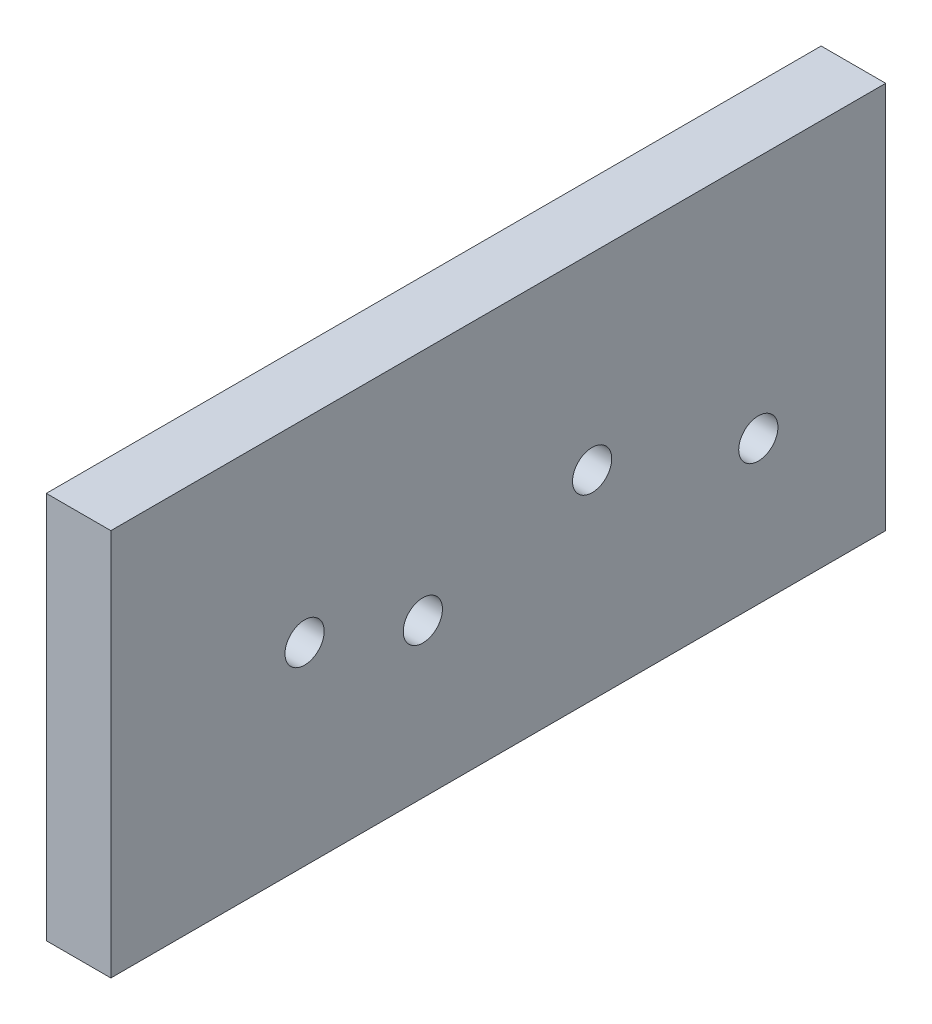
ISO-10303-21;
HEADER;
FILE_DESCRIPTION(('STEP AP214'),'2;1');
FILE_NAME('part.step','',(''),(''),'','','');
FILE_SCHEMA(('AUTOMOTIVE_DESIGN { 1 0 10303 214 1 1 1 1 }'));
ENDSEC;
DATA;
#1=APPLICATION_CONTEXT('core data for automotive mechanical design processes');
#2=APPLICATION_PROTOCOL_DEFINITION('international standard','automotive_design',2000,#1);
#3=PRODUCT_CONTEXT('',#1,'mechanical');
#4=PRODUCT('Part','Part','',(#3));
#5=PRODUCT_RELATED_PRODUCT_CATEGORY('part','',(#4));
#6=PRODUCT_DEFINITION_FORMATION('','',#4);
#7=PRODUCT_DEFINITION_CONTEXT('part definition',#1,'design');
#8=PRODUCT_DEFINITION('design','',#6,#7);
#9=PRODUCT_DEFINITION_SHAPE('','',#8);
#10=(LENGTH_UNIT() NAMED_UNIT(*) SI_UNIT(.MILLI.,.METRE.));
#11=(NAMED_UNIT(*) PLANE_ANGLE_UNIT() SI_UNIT($,.RADIAN.));
#12=(NAMED_UNIT(*) SI_UNIT($,.STERADIAN.) SOLID_ANGLE_UNIT());
#13=UNCERTAINTY_MEASURE_WITH_UNIT(LENGTH_MEASURE(1.E-05),#10,'distance_accuracy_value','');
#14=(GEOMETRIC_REPRESENTATION_CONTEXT(3) GLOBAL_UNCERTAINTY_ASSIGNED_CONTEXT((#13)) GLOBAL_UNIT_ASSIGNED_CONTEXT((#10,
#11,#12)) REPRESENTATION_CONTEXT('',''));
#15=CARTESIAN_POINT('',(0.,0.,0.));
#16=DIRECTION('',(0.,0.,1.));
#17=DIRECTION('',(1.,0.,0.));
#18=AXIS2_PLACEMENT_3D('',#15,#16,#17);
#19=CARTESIAN_POINT('',(12.7,-9.873506971,-51.1434579937716));
#20=DIRECTION('',(-1.,0.,0.));
#21=DIRECTION('',(0.,0.,1.));
#22=AXIS2_PLACEMENT_3D('',#19,#20,#21);
#23=CYLINDRICAL_SURFACE('',#22,3.85455777521835);
#24=CARTESIAN_POINT('',(12.7,-9.873506971,-51.1434579937716));
#25=DIRECTION('',(1.,0.,0.));
#26=DIRECTION('',(0.,0.,-1.));
#27=AXIS2_PLACEMENT_3D('',#24,#25,#26);
#28=CIRCLE('',#27,3.85455777521835);
#29=CARTESIAN_POINT('',(12.7,-9.873506971,-54.99801576899));
#30=VERTEX_POINT('',#29);
#31=EDGE_CURVE('E166',#30,#30,#28,.T.);
#32=ORIENTED_EDGE('',*,*,#31,.T.);
#33=EDGE_LOOP('',(#32));
#34=FACE_BOUND('',#33,.T.);
#35=CARTESIAN_POINT('',(5.08,-9.873506971,-51.1434579937716));
#36=DIRECTION('',(-1.,0.,0.));
#37=DIRECTION('',(0.,0.,1.));
#38=AXIS2_PLACEMENT_3D('',#35,#36,#37);
#39=CIRCLE('',#38,3.85455777521835);
#40=CARTESIAN_POINT('',(5.08,-9.873506971,-47.2889002185533));
#41=VERTEX_POINT('',#40);
#42=EDGE_CURVE('E55',#41,#41,#39,.T.);
#43=ORIENTED_EDGE('',*,*,#42,.T.);
#44=EDGE_LOOP('',(#43));
#45=FACE_BOUND('',#44,.T.);
#46=ADVANCED_FACE('F51',(#34,#45),#23,.F.);
#47=CARTESIAN_POINT('',(12.7,1.096077429,-18.4577335821185));
#48=DIRECTION('',(-1.,0.,0.));
#49=DIRECTION('',(0.,0.,1.));
#50=AXIS2_PLACEMENT_3D('',#47,#48,#49);
#51=CYLINDRICAL_SURFACE('',#50,3.85455777521835);
#52=CARTESIAN_POINT('',(12.7,1.096077429,-18.4577335821185));
#53=DIRECTION('',(1.,0.,0.));
#54=DIRECTION('',(0.,0.,-1.));
#55=AXIS2_PLACEMENT_3D('',#52,#53,#54);
#56=CIRCLE('',#55,3.85455777521835);
#57=CARTESIAN_POINT('',(12.7,1.096077429,-22.3122913573368));
#58=VERTEX_POINT('',#57);
#59=EDGE_CURVE('E162',#58,#58,#56,.T.);
#60=ORIENTED_EDGE('',*,*,#59,.T.);
#61=EDGE_LOOP('',(#60));
#62=FACE_BOUND('',#61,.T.);
#63=CARTESIAN_POINT('',(5.08,1.096077429,-18.4577335821185));
#64=DIRECTION('',(-1.,0.,0.));
#65=DIRECTION('',(0.,0.,1.));
#66=AXIS2_PLACEMENT_3D('',#63,#64,#65);
#67=CIRCLE('',#66,3.85455777521835);
#68=CARTESIAN_POINT('',(5.08,1.096077429,-14.6031758069001));
#69=VERTEX_POINT('',#68);
#70=EDGE_CURVE('E201',#69,#69,#67,.T.);
#71=ORIENTED_EDGE('',*,*,#70,.T.);
#72=EDGE_LOOP('',(#71));
#73=FACE_BOUND('',#72,.T.);
#74=ADVANCED_FACE('F287',(#62,#73),#51,.F.);
#75=CARTESIAN_POINT('',(12.7,0.,38.1));
#76=DIRECTION('',(-1.,0.,0.));
#77=DIRECTION('',(0.,0.,1.));
#78=AXIS2_PLACEMENT_3D('',#75,#76,#77);
#79=CYLINDRICAL_SURFACE('',#78,3.85455777521835);
#80=CARTESIAN_POINT('',(12.7,0.,38.1));
#81=DIRECTION('',(1.,0.,0.));
#82=DIRECTION('',(0.,0.,-1.));
#83=AXIS2_PLACEMENT_3D('',#80,#81,#82);
#84=CIRCLE('',#83,3.85455777521835);
#85=CARTESIAN_POINT('',(12.7,0.,34.2454422247817));
#86=VERTEX_POINT('',#85);
#87=EDGE_CURVE('E158',#86,#86,#84,.T.);
#88=ORIENTED_EDGE('',*,*,#87,.T.);
#89=EDGE_LOOP('',(#88));
#90=FACE_BOUND('',#89,.T.);
#91=CARTESIAN_POINT('',(5.08,0.,38.1));
#92=DIRECTION('',(-1.,0.,0.));
#93=DIRECTION('',(0.,0.,1.));
#94=AXIS2_PLACEMENT_3D('',#91,#92,#93);
#95=CIRCLE('',#94,3.85455777521835);
#96=CARTESIAN_POINT('',(5.08,0.,41.9545577752184));
#97=VERTEX_POINT('',#96);
#98=EDGE_CURVE('E197',#97,#97,#95,.T.);
#99=ORIENTED_EDGE('',*,*,#98,.T.);
#100=EDGE_LOOP('',(#99));
#101=FACE_BOUND('',#100,.T.);
#102=ADVANCED_FACE('F294',(#90,#101),#79,.F.);
#103=CARTESIAN_POINT('',(12.7,-7.860160654,14.8360220129459));
#104=DIRECTION('',(-1.,0.,0.));
#105=DIRECTION('',(0.,0.,1.));
#106=AXIS2_PLACEMENT_3D('',#103,#104,#105);
#107=CYLINDRICAL_SURFACE('',#106,3.85455777521835);
#108=CARTESIAN_POINT('',(12.7,-7.860160654,14.8360220129459));
#109=DIRECTION('',(1.,0.,0.));
#110=DIRECTION('',(0.,0.,-1.));
#111=AXIS2_PLACEMENT_3D('',#108,#109,#110);
#112=CIRCLE('',#111,3.85455777521835);
#113=CARTESIAN_POINT('',(12.7,-7.860160654,10.9814642377276));
#114=VERTEX_POINT('',#113);
#115=EDGE_CURVE('E170',#114,#114,#112,.T.);
#116=ORIENTED_EDGE('',*,*,#115,.T.);
#117=EDGE_LOOP('',(#116));
#118=FACE_BOUND('',#117,.T.);
#119=CARTESIAN_POINT('',(5.08,-7.860160654,14.8360220129459));
#120=DIRECTION('',(-1.,0.,0.));
#121=DIRECTION('',(0.,0.,1.));
#122=AXIS2_PLACEMENT_3D('',#119,#120,#121);
#123=CIRCLE('',#122,3.85455777521835);
#124=CARTESIAN_POINT('',(5.08,-7.860160654,18.6905797881643));
#125=VERTEX_POINT('',#124);
#126=EDGE_CURVE('E193',#125,#125,#123,.T.);
#127=ORIENTED_EDGE('',*,*,#126,.T.);
#128=EDGE_LOOP('',(#127));
#129=FACE_BOUND('',#128,.T.);
#130=ADVANCED_FACE('F298',(#118,#129),#107,.F.);
#131=CARTESIAN_POINT('',(12.7,-38.1,0.));
#132=DIRECTION('',(0.,1.,0.));
#133=DIRECTION('',(0.,0.,1.));
#134=AXIS2_PLACEMENT_3D('',#131,#132,#133);
#135=PLANE('',#134);
#136=CARTESIAN_POINT('',(6.35000000000002,-38.1,-63.5));
#137=DIRECTION('',(0.,-1.,0.));
#138=DIRECTION('',(0.,0.,-1.));
#139=AXIS2_PLACEMENT_3D('',#136,#137,#138);
#140=CIRCLE('',#139,3.17499999999999);
#141=CARTESIAN_POINT('',(6.35000000000002,-38.1,-66.675));
#142=VERTEX_POINT('',#141);
#143=EDGE_CURVE('E122',#142,#142,#140,.T.);
#144=ORIENTED_EDGE('',*,*,#143,.F.);
#145=EDGE_LOOP('',(#144));
#146=FACE_BOUND('',#145,.T.);
#147=CARTESIAN_POINT('',(6.35000000000001,-38.1,0.));
#148=DIRECTION('',(0.,-1.,0.));
#149=DIRECTION('',(0.,0.,-1.));
#150=AXIS2_PLACEMENT_3D('',#147,#148,#149);
#151=CIRCLE('',#150,3.17499999999999);
#152=CARTESIAN_POINT('',(6.35000000000001,-38.1,-3.17499999999997));
#153=VERTEX_POINT('',#152);
#154=EDGE_CURVE('E121',#153,#153,#151,.T.);
#155=ORIENTED_EDGE('',*,*,#154,.F.);
#156=EDGE_LOOP('',(#155));
#157=FACE_BOUND('',#156,.T.);
#158=CARTESIAN_POINT('',(6.35,-38.1,57.15));
#159=DIRECTION('',(0.,-1.,0.));
#160=DIRECTION('',(0.,0.,-1.));
#161=AXIS2_PLACEMENT_3D('',#158,#159,#160);
#162=CIRCLE('',#161,3.17499999999999);
#163=CARTESIAN_POINT('',(6.35,-38.1,53.975));
#164=VERTEX_POINT('',#163);
#165=EDGE_CURVE('E136',#164,#164,#162,.T.);
#166=ORIENTED_EDGE('',*,*,#165,.F.);
#167=EDGE_LOOP('',(#166));
#168=FACE_BOUND('',#167,.T.);
#169=DIRECTION('',(0.,0.,-1.));
#170=VECTOR('',#169,1.);
#171=CARTESIAN_POINT('',(0.,-38.1,0.));
#172=LINE('',#171,#170);
#173=CARTESIAN_POINT('',(0.,-38.1,76.2));
#174=VERTEX_POINT('',#173);
#175=CARTESIAN_POINT('',(0.,-38.1,-76.2));
#176=VERTEX_POINT('',#175);
#177=EDGE_CURVE('E144',#174,#176,#172,.T.);
#178=ORIENTED_EDGE('',*,*,#177,.T.);
#179=DIRECTION('',(-1.,0.,0.));
#180=VECTOR('',#179,1.);
#181=CARTESIAN_POINT('',(12.7,-38.1,-76.2));
#182=LINE('',#181,#180);
#183=CARTESIAN_POINT('',(12.7,-38.1,-76.2));
#184=VERTEX_POINT('',#183);
#185=EDGE_CURVE('E11',#184,#176,#182,.T.);
#186=ORIENTED_EDGE('',*,*,#185,.F.);
#187=DIRECTION('',(0.,0.,-1.));
#188=VECTOR('',#187,1.);
#189=CARTESIAN_POINT('',(12.7,-38.1,0.));
#190=LINE('',#189,#188);
#191=CARTESIAN_POINT('',(12.7,-38.1,76.2));
#192=VERTEX_POINT('',#191);
#193=EDGE_CURVE('E145',#192,#184,#190,.T.);
#194=ORIENTED_EDGE('',*,*,#193,.F.);
#195=DIRECTION('',(-1.,0.,0.));
#196=VECTOR('',#195,1.);
#197=CARTESIAN_POINT('',(12.7,-38.1,76.2));
#198=LINE('',#197,#196);
#199=EDGE_CURVE('E71',#192,#174,#198,.T.);
#200=ORIENTED_EDGE('',*,*,#199,.T.);
#201=EDGE_LOOP('',(#178,#186,#194,#200));
#202=FACE_BOUND('',#201,.T.);
#203=ADVANCED_FACE('F53',(#146,#157,#168,#202),#135,.F.);
#204=CARTESIAN_POINT('',(12.7,0.,-76.2));
#205=DIRECTION('',(0.,0.,1.));
#206=DIRECTION('',(1.,0.,0.));
#207=AXIS2_PLACEMENT_3D('',#204,#205,#206);
#208=PLANE('',#207);
#209=DIRECTION('',(0.,1.,0.));
#210=VECTOR('',#209,1.);
#211=CARTESIAN_POINT('',(0.,0.,-76.2));
#212=LINE('',#211,#210);
#213=CARTESIAN_POINT('',(0.,38.1,-76.2));
#214=VERTEX_POINT('',#213);
#215=EDGE_CURVE('E176',#176,#214,#212,.T.);
#216=ORIENTED_EDGE('',*,*,#215,.T.);
#217=DIRECTION('',(-1.,0.,0.));
#218=VECTOR('',#217,1.);
#219=CARTESIAN_POINT('',(12.7,38.1,-76.2));
#220=LINE('',#219,#218);
#221=CARTESIAN_POINT('',(12.7,38.1,-76.2));
#222=VERTEX_POINT('',#221);
#223=EDGE_CURVE('E62',#222,#214,#220,.T.);
#224=ORIENTED_EDGE('',*,*,#223,.F.);
#225=DIRECTION('',(0.,1.,0.));
#226=VECTOR('',#225,1.);
#227=CARTESIAN_POINT('',(12.7,0.,-76.2));
#228=LINE('',#227,#226);
#229=EDGE_CURVE('E99',#184,#222,#228,.T.);
#230=ORIENTED_EDGE('',*,*,#229,.F.);
#231=ORIENTED_EDGE('',*,*,#185,.T.);
#232=EDGE_LOOP('',(#216,#224,#230,#231));
#233=FACE_BOUND('',#232,.T.);
#234=ADVANCED_FACE('F282',(#233),#208,.F.);
#235=CARTESIAN_POINT('',(12.7,38.1,0.));
#236=DIRECTION('',(0.,1.,0.));
#237=DIRECTION('',(0.,0.,1.));
#238=AXIS2_PLACEMENT_3D('',#235,#236,#237);
#239=PLANE('',#238);
#240=DIRECTION('',(0.,0.,-1.));
#241=VECTOR('',#240,1.);
#242=CARTESIAN_POINT('',(0.,38.1,0.));
#243=LINE('',#242,#241);
#244=CARTESIAN_POINT('',(0.,38.1,76.2));
#245=VERTEX_POINT('',#244);
#246=EDGE_CURVE('E180',#245,#214,#243,.T.);
#247=ORIENTED_EDGE('',*,*,#246,.F.);
#248=DIRECTION('',(-1.,0.,0.));
#249=VECTOR('',#248,1.);
#250=CARTESIAN_POINT('',(12.7,38.1,76.2));
#251=LINE('',#250,#249);
#252=CARTESIAN_POINT('',(12.7,38.1,76.2));
#253=VERTEX_POINT('',#252);
#254=EDGE_CURVE('E87',#253,#245,#251,.T.);
#255=ORIENTED_EDGE('',*,*,#254,.F.);
#256=DIRECTION('',(0.,0.,-1.));
#257=VECTOR('',#256,1.);
#258=CARTESIAN_POINT('',(12.7,38.1,0.));
#259=LINE('',#258,#257);
#260=EDGE_CURVE('E151',#253,#222,#259,.T.);
#261=ORIENTED_EDGE('',*,*,#260,.T.);
#262=ORIENTED_EDGE('',*,*,#223,.T.);
#263=EDGE_LOOP('',(#247,#255,#261,#262));
#264=FACE_BOUND('',#263,.T.);
#265=ADVANCED_FACE('F275',(#264),#239,.T.);
#266=CARTESIAN_POINT('',(12.7,0.,76.2));
#267=DIRECTION('',(0.,0.,1.));
#268=DIRECTION('',(1.,0.,0.));
#269=AXIS2_PLACEMENT_3D('',#266,#267,#268);
#270=PLANE('',#269);
#271=DIRECTION('',(0.,1.,0.));
#272=VECTOR('',#271,1.);
#273=CARTESIAN_POINT('',(0.,0.,76.2));
#274=LINE('',#273,#272);
#275=EDGE_CURVE('E148',#174,#245,#274,.T.);
#276=ORIENTED_EDGE('',*,*,#275,.F.);
#277=ORIENTED_EDGE('',*,*,#199,.F.);
#278=DIRECTION('',(0.,1.,0.));
#279=VECTOR('',#278,1.);
#280=CARTESIAN_POINT('',(12.7,0.,76.2));
#281=LINE('',#280,#279);
#282=EDGE_CURVE('E155',#192,#253,#281,.T.);
#283=ORIENTED_EDGE('',*,*,#282,.T.);
#284=ORIENTED_EDGE('',*,*,#254,.T.);
#285=EDGE_LOOP('',(#276,#277,#283,#284));
#286=FACE_BOUND('',#285,.T.);
#287=ADVANCED_FACE('F273',(#286),#270,.T.);
#288=CARTESIAN_POINT('',(12.7,0.,0.));
#289=DIRECTION('',(1.,0.,0.));
#290=DIRECTION('',(0.,0.,-1.));
#291=AXIS2_PLACEMENT_3D('',#288,#289,#290);
#292=PLANE('',#291);
#293=ORIENTED_EDGE('',*,*,#193,.T.);
#294=ORIENTED_EDGE('',*,*,#229,.T.);
#295=ORIENTED_EDGE('',*,*,#260,.F.);
#296=ORIENTED_EDGE('',*,*,#282,.F.);
#297=EDGE_LOOP('',(#293,#294,#295,#296));
#298=FACE_BOUND('',#297,.T.);
#299=ORIENTED_EDGE('',*,*,#87,.F.);
#300=EDGE_LOOP('',(#299));
#301=FACE_BOUND('',#300,.T.);
#302=ORIENTED_EDGE('',*,*,#59,.F.);
#303=EDGE_LOOP('',(#302));
#304=FACE_BOUND('',#303,.T.);
#305=ORIENTED_EDGE('',*,*,#31,.F.);
#306=EDGE_LOOP('',(#305));
#307=FACE_BOUND('',#306,.T.);
#308=ORIENTED_EDGE('',*,*,#115,.F.);
#309=EDGE_LOOP('',(#308));
#310=FACE_BOUND('',#309,.T.);
#311=ADVANCED_FACE('F264',(#298,#301,#304,#307,#310),#292,.T.);
#312=CARTESIAN_POINT('',(0.,0.,0.));
#313=DIRECTION('',(1.,0.,0.));
#314=DIRECTION('',(0.,0.,-1.));
#315=AXIS2_PLACEMENT_3D('',#312,#313,#314);
#316=PLANE('',#315);
#317=CARTESIAN_POINT('',(0.,0.,38.1));
#318=DIRECTION('',(-1.,0.,0.));
#319=DIRECTION('',(0.,0.,1.));
#320=AXIS2_PLACEMENT_3D('',#317,#318,#319);
#321=CIRCLE('',#320,7.9375);
#322=CARTESIAN_POINT('',(0.,0.,46.0375));
#323=VERTEX_POINT('',#322);
#324=EDGE_CURVE('E243',#323,#323,#321,.T.);
#325=ORIENTED_EDGE('',*,*,#324,.F.);
#326=EDGE_LOOP('',(#325));
#327=FACE_BOUND('',#326,.T.);
#328=CARTESIAN_POINT('',(0.,-7.860160654,14.8360220129459));
#329=DIRECTION('',(-1.,0.,0.));
#330=DIRECTION('',(0.,0.,1.));
#331=AXIS2_PLACEMENT_3D('',#328,#329,#330);
#332=CIRCLE('',#331,7.9375);
#333=CARTESIAN_POINT('',(0.,-7.860160654,22.7735220129459));
#334=VERTEX_POINT('',#333);
#335=EDGE_CURVE('E239',#334,#334,#332,.T.);
#336=ORIENTED_EDGE('',*,*,#335,.F.);
#337=EDGE_LOOP('',(#336));
#338=FACE_BOUND('',#337,.T.);
#339=CARTESIAN_POINT('',(0.,1.096077429,-18.4577335821185));
#340=DIRECTION('',(-1.,0.,0.));
#341=DIRECTION('',(0.,0.,1.));
#342=AXIS2_PLACEMENT_3D('',#339,#340,#341);
#343=CIRCLE('',#342,7.9375);
#344=CARTESIAN_POINT('',(0.,1.096077429,-10.5202335821185));
#345=VERTEX_POINT('',#344);
#346=EDGE_CURVE('E231',#345,#345,#343,.T.);
#347=ORIENTED_EDGE('',*,*,#346,.F.);
#348=EDGE_LOOP('',(#347));
#349=FACE_BOUND('',#348,.T.);
#350=CARTESIAN_POINT('',(0.,-9.873506971,-51.1434579937716));
#351=DIRECTION('',(-1.,0.,0.));
#352=DIRECTION('',(0.,0.,1.));
#353=AXIS2_PLACEMENT_3D('',#350,#351,#352);
#354=CIRCLE('',#353,7.9375);
#355=CARTESIAN_POINT('',(0.,-9.873506971,-43.2059579937716));
#356=VERTEX_POINT('',#355);
#357=EDGE_CURVE('E222',#356,#356,#354,.T.);
#358=ORIENTED_EDGE('',*,*,#357,.F.);
#359=EDGE_LOOP('',(#358));
#360=FACE_BOUND('',#359,.T.);
#361=ORIENTED_EDGE('',*,*,#177,.F.);
#362=ORIENTED_EDGE('',*,*,#275,.T.);
#363=ORIENTED_EDGE('',*,*,#246,.T.);
#364=ORIENTED_EDGE('',*,*,#215,.F.);
#365=EDGE_LOOP('',(#361,#362,#363,#364));
#366=FACE_BOUND('',#365,.T.);
#367=ADVANCED_FACE('F260',(#327,#338,#349,#360,#366),#316,.F.);
#368=CARTESIAN_POINT('',(6.35,0.,57.15));
#369=DIRECTION('',(0.,-1.,0.));
#370=DIRECTION('',(0.,0.,-1.));
#371=AXIS2_PLACEMENT_3D('',#368,#369,#370);
#372=CONICAL_SURFACE('',#371,3.17499999999999,1.02974425867665);
#373=CARTESIAN_POINT('',(6.34999999999999,1.9077324654125,57.15));
#374=VERTEX_POINT('',#373);
#375=VERTEX_LOOP('',#374);
#376=FACE_BOUND('',#375,.T.);
#377=CARTESIAN_POINT('',(6.35,0.,57.15));
#378=DIRECTION('',(0.,-1.,0.));
#379=DIRECTION('',(0.,0.,-1.));
#380=AXIS2_PLACEMENT_3D('',#377,#378,#379);
#381=CIRCLE('',#380,3.17499999999999);
#382=CARTESIAN_POINT('',(6.35,0.,53.975));
#383=VERTEX_POINT('',#382);
#384=EDGE_CURVE('E140',#383,#383,#381,.T.);
#385=ORIENTED_EDGE('',*,*,#384,.T.);
#386=EDGE_LOOP('',(#385));
#387=FACE_BOUND('',#386,.T.);
#388=ADVANCED_FACE('F263',(#376,#387),#372,.F.);
#389=CARTESIAN_POINT('',(6.35,-38.1,57.15));
#390=DIRECTION('',(0.,-1.,0.));
#391=DIRECTION('',(0.,0.,-1.));
#392=AXIS2_PLACEMENT_3D('',#389,#390,#391);
#393=CYLINDRICAL_SURFACE('',#392,3.17499999999999);
#394=ORIENTED_EDGE('',*,*,#384,.F.);
#395=EDGE_LOOP('',(#394));
#396=FACE_BOUND('',#395,.T.);
#397=ORIENTED_EDGE('',*,*,#165,.T.);
#398=EDGE_LOOP('',(#397));
#399=FACE_BOUND('',#398,.T.);
#400=ADVANCED_FACE('F337',(#396,#399),#393,.F.);
#401=CARTESIAN_POINT('',(6.35000000000001,0.,0.));
#402=DIRECTION('',(0.,-1.,0.));
#403=DIRECTION('',(0.,0.,-1.));
#404=AXIS2_PLACEMENT_3D('',#401,#402,#403);
#405=CONICAL_SURFACE('',#404,3.17499999999999,1.02974425867665);
#406=CARTESIAN_POINT('',(6.35,1.9077324654125,0.));
#407=VERTEX_POINT('',#406);
#408=VERTEX_LOOP('',#407);
#409=FACE_BOUND('',#408,.T.);
#410=CARTESIAN_POINT('',(6.35000000000001,0.,0.));
#411=DIRECTION('',(0.,-1.,0.));
#412=DIRECTION('',(0.,0.,-1.));
#413=AXIS2_PLACEMENT_3D('',#410,#411,#412);
#414=CIRCLE('',#413,3.17499999999999);
#415=CARTESIAN_POINT('',(6.35000000000001,0.,-3.17499999999998));
#416=VERTEX_POINT('',#415);
#417=EDGE_CURVE('E127',#416,#416,#414,.T.);
#418=ORIENTED_EDGE('',*,*,#417,.T.);
#419=EDGE_LOOP('',(#418));
#420=FACE_BOUND('',#419,.T.);
#421=ADVANCED_FACE('F333',(#409,#420),#405,.F.);
#422=CARTESIAN_POINT('',(6.35000000000001,-38.1,0.));
#423=DIRECTION('',(0.,-1.,0.));
#424=DIRECTION('',(0.,0.,-1.));
#425=AXIS2_PLACEMENT_3D('',#422,#423,#424);
#426=CYLINDRICAL_SURFACE('',#425,3.17499999999999);
#427=ORIENTED_EDGE('',*,*,#417,.F.);
#428=EDGE_LOOP('',(#427));
#429=FACE_BOUND('',#428,.T.);
#430=ORIENTED_EDGE('',*,*,#154,.T.);
#431=EDGE_LOOP('',(#430));
#432=FACE_BOUND('',#431,.T.);
#433=ADVANCED_FACE('F114',(#429,#432),#426,.F.);
#434=CARTESIAN_POINT('',(6.35000000000002,0.,-63.5));
#435=DIRECTION('',(0.,-1.,0.));
#436=DIRECTION('',(0.,0.,-1.));
#437=AXIS2_PLACEMENT_3D('',#434,#435,#436);
#438=CONICAL_SURFACE('',#437,3.17499999999999,1.02974425867665);
#439=CARTESIAN_POINT('',(6.35000000000001,1.9077324654125,-63.5));
#440=VERTEX_POINT('',#439);
#441=VERTEX_LOOP('',#440);
#442=FACE_BOUND('',#441,.T.);
#443=CARTESIAN_POINT('',(6.35000000000002,0.,-63.5));
#444=DIRECTION('',(0.,-1.,0.));
#445=DIRECTION('',(0.,0.,-1.));
#446=AXIS2_PLACEMENT_3D('',#443,#444,#445);
#447=CIRCLE('',#446,3.17499999999999);
#448=CARTESIAN_POINT('',(6.35000000000002,0.,-66.675));
#449=VERTEX_POINT('',#448);
#450=EDGE_CURVE('E118',#449,#449,#447,.T.);
#451=ORIENTED_EDGE('',*,*,#450,.T.);
#452=EDGE_LOOP('',(#451));
#453=FACE_BOUND('',#452,.T.);
#454=ADVANCED_FACE('F110',(#442,#453),#438,.F.);
#455=CARTESIAN_POINT('',(6.35000000000002,-38.1,-63.5));
#456=DIRECTION('',(0.,-1.,0.));
#457=DIRECTION('',(0.,0.,-1.));
#458=AXIS2_PLACEMENT_3D('',#455,#456,#457);
#459=CYLINDRICAL_SURFACE('',#458,3.17499999999999);
#460=ORIENTED_EDGE('',*,*,#450,.F.);
#461=EDGE_LOOP('',(#460));
#462=FACE_BOUND('',#461,.T.);
#463=ORIENTED_EDGE('',*,*,#143,.T.);
#464=EDGE_LOOP('',(#463));
#465=FACE_BOUND('',#464,.T.);
#466=ADVANCED_FACE('F113',(#462,#465),#459,.F.);
#467=CARTESIAN_POINT('',(5.08,-9.873506971,-51.1434579937716));
#468=DIRECTION('',(-1.,0.,0.));
#469=DIRECTION('',(0.,0.,1.));
#470=AXIS2_PLACEMENT_3D('',#467,#468,#469);
#471=CYLINDRICAL_SURFACE('',#470,7.9375);
#472=CARTESIAN_POINT('',(5.08,-9.873506971,-51.1434579937716));
#473=DIRECTION('',(-1.,0.,0.));
#474=DIRECTION('',(0.,0.,1.));
#475=AXIS2_PLACEMENT_3D('',#472,#473,#474);
#476=CIRCLE('',#475,7.9375);
#477=CARTESIAN_POINT('',(5.08,-9.873506971,-43.2059579937716));
#478=VERTEX_POINT('',#477);
#479=EDGE_CURVE('E219',#478,#478,#476,.T.);
#480=ORIENTED_EDGE('',*,*,#479,.F.);
#481=EDGE_LOOP('',(#480));
#482=FACE_BOUND('',#481,.T.);
#483=ORIENTED_EDGE('',*,*,#357,.T.);
#484=EDGE_LOOP('',(#483));
#485=FACE_BOUND('',#484,.T.);
#486=ADVANCED_FACE('F215',(#482,#485),#471,.F.);
#487=CARTESIAN_POINT('',(5.08,-9.873506971,-51.1434579937716));
#488=DIRECTION('',(-1.,0.,0.));
#489=DIRECTION('',(0.,0.,1.));
#490=AXIS2_PLACEMENT_3D('',#487,#488,#489);
#491=PLANE('',#490);
#492=ORIENTED_EDGE('',*,*,#42,.F.);
#493=EDGE_LOOP('',(#492));
#494=FACE_BOUND('',#493,.T.);
#495=ORIENTED_EDGE('',*,*,#479,.T.);
#496=EDGE_LOOP('',(#495));
#497=FACE_BOUND('',#496,.T.);
#498=ADVANCED_FACE('F211',(#494,#497),#491,.T.);
#499=CARTESIAN_POINT('',(5.08,1.096077429,-18.4577335821185));
#500=DIRECTION('',(-1.,0.,0.));
#501=DIRECTION('',(0.,0.,1.));
#502=AXIS2_PLACEMENT_3D('',#499,#500,#501);
#503=CYLINDRICAL_SURFACE('',#502,7.9375);
#504=CARTESIAN_POINT('',(5.08,1.096077429,-18.4577335821185));
#505=DIRECTION('',(-1.,0.,0.));
#506=DIRECTION('',(0.,0.,1.));
#507=AXIS2_PLACEMENT_3D('',#504,#505,#506);
#508=CIRCLE('',#507,7.9375);
#509=CARTESIAN_POINT('',(5.08,1.096077429,-10.5202335821185));
#510=VERTEX_POINT('',#509);
#511=EDGE_CURVE('E225',#510,#510,#508,.T.);
#512=ORIENTED_EDGE('',*,*,#511,.F.);
#513=EDGE_LOOP('',(#512));
#514=FACE_BOUND('',#513,.T.);
#515=ORIENTED_EDGE('',*,*,#346,.T.);
#516=EDGE_LOOP('',(#515));
#517=FACE_BOUND('',#516,.T.);
#518=ADVANCED_FACE('F214',(#514,#517),#503,.F.);
#519=CARTESIAN_POINT('',(5.08,1.096077429,-18.4577335821185));
#520=DIRECTION('',(-1.,0.,0.));
#521=DIRECTION('',(0.,0.,1.));
#522=AXIS2_PLACEMENT_3D('',#519,#520,#521);
#523=PLANE('',#522);
#524=ORIENTED_EDGE('',*,*,#70,.F.);
#525=EDGE_LOOP('',(#524));
#526=FACE_BOUND('',#525,.T.);
#527=ORIENTED_EDGE('',*,*,#511,.T.);
#528=EDGE_LOOP('',(#527));
#529=FACE_BOUND('',#528,.T.);
#530=ADVANCED_FACE('F317',(#526,#529),#523,.T.);
#531=CARTESIAN_POINT('',(5.08,-7.860160654,14.8360220129459));
#532=DIRECTION('',(-1.,0.,0.));
#533=DIRECTION('',(0.,0.,1.));
#534=AXIS2_PLACEMENT_3D('',#531,#532,#533);
#535=CYLINDRICAL_SURFACE('',#534,7.9375);
#536=CARTESIAN_POINT('',(5.08,-7.860160654,14.8360220129459));
#537=DIRECTION('',(-1.,0.,0.));
#538=DIRECTION('',(0.,0.,1.));
#539=AXIS2_PLACEMENT_3D('',#536,#537,#538);
#540=CIRCLE('',#539,7.9375);
#541=CARTESIAN_POINT('',(5.08,-7.860160654,22.7735220129459));
#542=VERTEX_POINT('',#541);
#543=EDGE_CURVE('E235',#542,#542,#540,.T.);
#544=ORIENTED_EDGE('',*,*,#543,.F.);
#545=EDGE_LOOP('',(#544));
#546=FACE_BOUND('',#545,.T.);
#547=ORIENTED_EDGE('',*,*,#335,.T.);
#548=EDGE_LOOP('',(#547));
#549=FACE_BOUND('',#548,.T.);
#550=ADVANCED_FACE('F314',(#546,#549),#535,.F.);
#551=CARTESIAN_POINT('',(5.08,-7.860160654,14.8360220129459));
#552=DIRECTION('',(-1.,0.,0.));
#553=DIRECTION('',(0.,0.,1.));
#554=AXIS2_PLACEMENT_3D('',#551,#552,#553);
#555=PLANE('',#554);
#556=ORIENTED_EDGE('',*,*,#126,.F.);
#557=EDGE_LOOP('',(#556));
#558=FACE_BOUND('',#557,.T.);
#559=ORIENTED_EDGE('',*,*,#543,.T.);
#560=EDGE_LOOP('',(#559));
#561=FACE_BOUND('',#560,.T.);
#562=ADVANCED_FACE('F256',(#558,#561),#555,.T.);
#563=CARTESIAN_POINT('',(5.08,0.,38.1));
#564=DIRECTION('',(-1.,0.,0.));
#565=DIRECTION('',(0.,0.,1.));
#566=AXIS2_PLACEMENT_3D('',#563,#564,#565);
#567=CYLINDRICAL_SURFACE('',#566,7.9375);
#568=CARTESIAN_POINT('',(5.08,0.,38.1));
#569=DIRECTION('',(-1.,0.,0.));
#570=DIRECTION('',(0.,0.,1.));
#571=AXIS2_PLACEMENT_3D('',#568,#569,#570);
#572=CIRCLE('',#571,7.9375);
#573=CARTESIAN_POINT('',(5.08,0.,46.0375));
#574=VERTEX_POINT('',#573);
#575=EDGE_CURVE('E198',#574,#574,#572,.T.);
#576=ORIENTED_EDGE('',*,*,#575,.F.);
#577=EDGE_LOOP('',(#576));
#578=FACE_BOUND('',#577,.T.);
#579=ORIENTED_EDGE('',*,*,#324,.T.);
#580=EDGE_LOOP('',(#579));
#581=FACE_BOUND('',#580,.T.);
#582=ADVANCED_FACE('F253',(#578,#581),#567,.F.);
#583=CARTESIAN_POINT('',(5.08,0.,38.1));
#584=DIRECTION('',(-1.,0.,0.));
#585=DIRECTION('',(0.,0.,1.));
#586=AXIS2_PLACEMENT_3D('',#583,#584,#585);
#587=PLANE('',#586);
#588=ORIENTED_EDGE('',*,*,#98,.F.);
#589=EDGE_LOOP('',(#588));
#590=FACE_BOUND('',#589,.T.);
#591=ORIENTED_EDGE('',*,*,#575,.T.);
#592=EDGE_LOOP('',(#591));
#593=FACE_BOUND('',#592,.T.);
#594=ADVANCED_FACE('F251',(#590,#593),#587,.T.);
#595=CLOSED_SHELL('',(#46,#74,#102,#130,#203,#234,#265,#287,#311,#367,#388,#400,#421,#433,#454,
#466,#486,#498,#518,#530,#550,#562,#582,#594));
#596=MANIFOLD_SOLID_BREP('B2',#595);
#597=ADVANCED_BREP_SHAPE_REPRESENTATION('',(#18,#596),#14);
#598=SHAPE_DEFINITION_REPRESENTATION(#9,#597);
ENDSEC;
END-ISO-10303-21;
